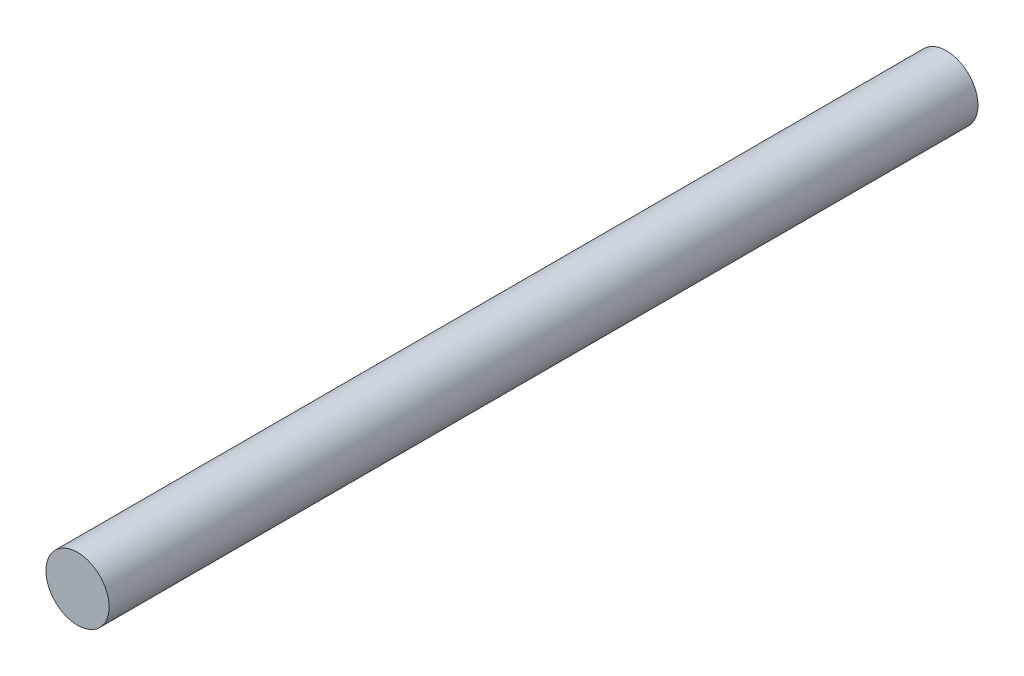
ISO-10303-21;
HEADER;
FILE_DESCRIPTION(('STEP AP214'),'2;1');
FILE_NAME('part.step','',(''),(''),'','','');
FILE_SCHEMA(('AUTOMOTIVE_DESIGN { 1 0 10303 214 1 1 1 1 }'));
ENDSEC;
DATA;
#1=APPLICATION_CONTEXT('core data for automotive mechanical design processes');
#2=APPLICATION_PROTOCOL_DEFINITION('international standard','automotive_design',2000,#1);
#3=PRODUCT_CONTEXT('',#1,'mechanical');
#4=PRODUCT('Part','Part','',(#3));
#5=PRODUCT_RELATED_PRODUCT_CATEGORY('part','',(#4));
#6=PRODUCT_DEFINITION_FORMATION('','',#4);
#7=PRODUCT_DEFINITION_CONTEXT('part definition',#1,'design');
#8=PRODUCT_DEFINITION('design','',#6,#7);
#9=PRODUCT_DEFINITION_SHAPE('','',#8);
#10=(LENGTH_UNIT() NAMED_UNIT(*) SI_UNIT(.MILLI.,.METRE.));
#11=(NAMED_UNIT(*) PLANE_ANGLE_UNIT() SI_UNIT($,.RADIAN.));
#12=(NAMED_UNIT(*) SI_UNIT($,.STERADIAN.) SOLID_ANGLE_UNIT());
#13=UNCERTAINTY_MEASURE_WITH_UNIT(LENGTH_MEASURE(1.E-05),#10,'distance_accuracy_value','');
#14=(GEOMETRIC_REPRESENTATION_CONTEXT(3) GLOBAL_UNCERTAINTY_ASSIGNED_CONTEXT((#13)) GLOBAL_UNIT_ASSIGNED_CONTEXT((#10,
#11,#12)) REPRESENTATION_CONTEXT('',''));
#15=CARTESIAN_POINT('',(0.,0.,0.));
#16=DIRECTION('',(0.,0.,1.));
#17=DIRECTION('',(1.,0.,0.));
#18=AXIS2_PLACEMENT_3D('',#15,#16,#17);
#19=CARTESIAN_POINT('',(0.,0.,110.));
#20=DIRECTION('',(0.,0.,-1.));
#21=DIRECTION('',(-1.,0.,0.));
#22=AXIS2_PLACEMENT_3D('',#19,#20,#21);
#23=CYLINDRICAL_SURFACE('',#22,4.);
#24=CARTESIAN_POINT('',(0.,0.,110.));
#25=DIRECTION('',(0.,0.,1.));
#26=DIRECTION('',(1.,0.,0.));
#27=AXIS2_PLACEMENT_3D('',#24,#25,#26);
#28=CIRCLE('',#27,4.);
#29=CARTESIAN_POINT('',(4.,0.,110.));
#30=VERTEX_POINT('',#29);
#31=EDGE_CURVE('E10',#30,#30,#28,.T.);
#32=ORIENTED_EDGE('',*,*,#31,.F.);
#33=EDGE_LOOP('',(#32));
#34=FACE_BOUND('',#33,.T.);
#35=CARTESIAN_POINT('',(0.,0.,0.));
#36=DIRECTION('',(0.,0.,1.));
#37=DIRECTION('',(1.,0.,0.));
#38=AXIS2_PLACEMENT_3D('',#35,#36,#37);
#39=CIRCLE('',#38,4.);
#40=CARTESIAN_POINT('',(4.,0.,0.));
#41=VERTEX_POINT('',#40);
#42=EDGE_CURVE('E46',#41,#41,#39,.T.);
#43=ORIENTED_EDGE('',*,*,#42,.T.);
#44=EDGE_LOOP('',(#43));
#45=FACE_BOUND('',#44,.T.);
#46=ADVANCED_FACE('F43',(#34,#45),#23,.T.);
#47=CARTESIAN_POINT('',(0.,0.,110.));
#48=DIRECTION('',(0.,0.,1.));
#49=DIRECTION('',(1.,0.,0.));
#50=AXIS2_PLACEMENT_3D('',#47,#48,#49);
#51=PLANE('',#50);
#52=ORIENTED_EDGE('',*,*,#31,.T.);
#53=EDGE_LOOP('',(#52));
#54=FACE_BOUND('',#53,.T.);
#55=ADVANCED_FACE('F60',(#54),#51,.T.);
#56=CARTESIAN_POINT('',(0.,0.,0.));
#57=DIRECTION('',(0.,0.,1.));
#58=DIRECTION('',(1.,0.,0.));
#59=AXIS2_PLACEMENT_3D('',#56,#57,#58);
#60=PLANE('',#59);
#61=ORIENTED_EDGE('',*,*,#42,.F.);
#62=EDGE_LOOP('',(#61));
#63=FACE_BOUND('',#62,.T.);
#64=ADVANCED_FACE('F58',(#63),#60,.F.);
#65=CLOSED_SHELL('',(#46,#55,#64));
#66=MANIFOLD_SOLID_BREP('B2',#65);
#67=ADVANCED_BREP_SHAPE_REPRESENTATION('',(#18,#66),#14);
#68=SHAPE_DEFINITION_REPRESENTATION(#9,#67);
ENDSEC;
END-ISO-10303-21;
